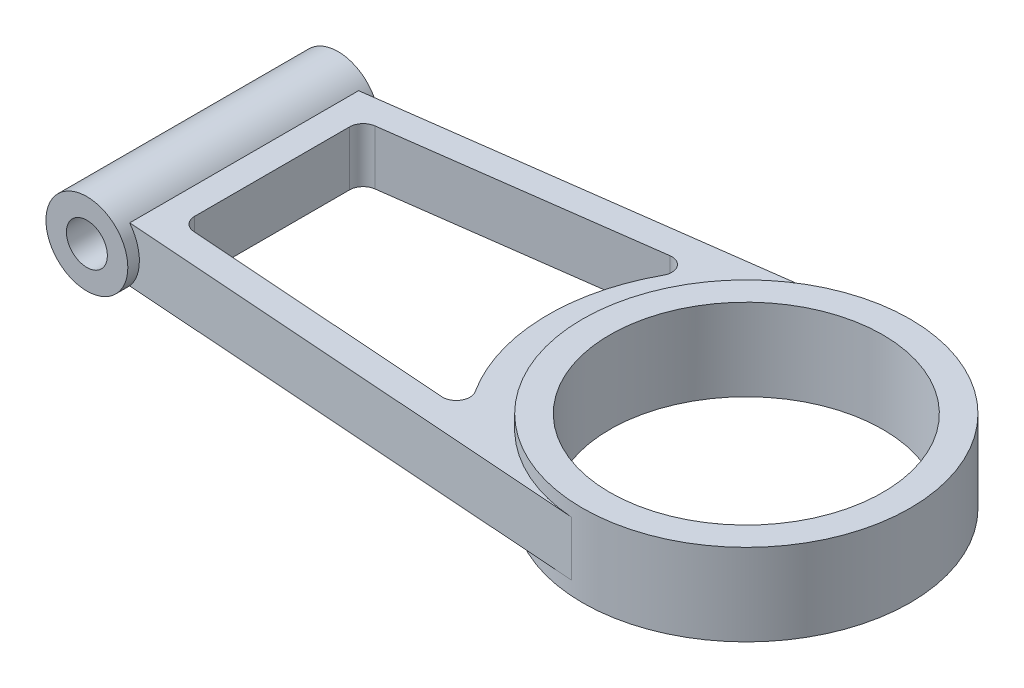
ISO-10303-21;
HEADER;
FILE_DESCRIPTION(('STEP AP214'),'2;1');
FILE_NAME('part.step','',(''),(''),'','','');
FILE_SCHEMA(('AUTOMOTIVE_DESIGN { 1 0 10303 214 1 1 1 1 }'));
ENDSEC;
DATA;
#1=APPLICATION_CONTEXT('core data for automotive mechanical design processes');
#2=APPLICATION_PROTOCOL_DEFINITION('international standard','automotive_design',2000,#1);
#3=PRODUCT_CONTEXT('',#1,'mechanical');
#4=PRODUCT('Part','Part','',(#3));
#5=PRODUCT_RELATED_PRODUCT_CATEGORY('part','',(#4));
#6=PRODUCT_DEFINITION_FORMATION('','',#4);
#7=PRODUCT_DEFINITION_CONTEXT('part definition',#1,'design');
#8=PRODUCT_DEFINITION('design','',#6,#7);
#9=PRODUCT_DEFINITION_SHAPE('','',#8);
#10=(LENGTH_UNIT() NAMED_UNIT(*) SI_UNIT(.MILLI.,.METRE.));
#11=(NAMED_UNIT(*) PLANE_ANGLE_UNIT() SI_UNIT($,.RADIAN.));
#12=(NAMED_UNIT(*) SI_UNIT($,.STERADIAN.) SOLID_ANGLE_UNIT());
#13=UNCERTAINTY_MEASURE_WITH_UNIT(LENGTH_MEASURE(1.E-05),#10,'distance_accuracy_value','');
#14=(GEOMETRIC_REPRESENTATION_CONTEXT(3) GLOBAL_UNCERTAINTY_ASSIGNED_CONTEXT((#13)) GLOBAL_UNIT_ASSIGNED_CONTEXT((#10,
#11,#12)) REPRESENTATION_CONTEXT('',''));
#15=CARTESIAN_POINT('',(0.,0.,0.));
#16=DIRECTION('',(0.,0.,1.));
#17=DIRECTION('',(1.,0.,0.));
#18=AXIS2_PLACEMENT_3D('',#15,#16,#17);
#19=CARTESIAN_POINT('',(0.,-10.,0.));
#20=DIRECTION('',(0.,1.,0.));
#21=DIRECTION('',(0.,0.,1.));
#22=AXIS2_PLACEMENT_3D('',#19,#20,#21);
#23=PLANE('',#22);
#24=CARTESIAN_POINT('',(-45.9529611182613,-10.,-23.2085762529355));
#25=DIRECTION('',(0.,1.,0.));
#26=DIRECTION('',(0.,0.,1.));
#27=AXIS2_PLACEMENT_3D('',#24,#25,#26);
#28=CIRCLE('',#27,5.);
#29=CARTESIAN_POINT('',(-46.6225823905644,-10.,-28.163534108627));
#30=VERTEX_POINT('',#29);
#31=CARTESIAN_POINT('',(-50.9529611182613,-10.,-23.2085762529355));
#32=VERTEX_POINT('',#31);
#33=EDGE_CURVE('E164',#30,#32,#28,.T.);
#34=ORIENTED_EDGE('',*,*,#33,.T.);
#35=DIRECTION('',(0.,0.,1.));
#36=VECTOR('',#35,1.);
#37=CARTESIAN_POINT('',(-50.9529611182613,-10.,0.));
#38=LINE('',#37,#36);
#39=CARTESIAN_POINT('',(-50.9529611182613,-10.,33.5249609813028));
#40=VERTEX_POINT('',#39);
#41=EDGE_CURVE('E188',#32,#40,#38,.T.);
#42=ORIENTED_EDGE('',*,*,#41,.T.);
#43=CARTESIAN_POINT('',(-45.9529611182613,-10.,33.5249609813028));
#44=DIRECTION('',(0.,1.,0.));
#45=DIRECTION('',(0.,0.,1.));
#46=AXIS2_PLACEMENT_3D('',#43,#44,#45);
#47=CIRCLE('',#46,5.);
#48=CARTESIAN_POINT('',(-46.308923364552,-10.,38.5122739732069));
#49=VERTEX_POINT('',#48);
#50=EDGE_CURVE('E185',#40,#49,#47,.T.);
#51=ORIENTED_EDGE('',*,*,#50,.T.);
#52=DIRECTION('',(0.997462598380824,0.,0.071192449258159));
#53=VECTOR('',#52,1.);
#54=CARTESIAN_POINT('',(-2.96953662430921,-10.,41.6055599734971));
#55=LINE('',#54,#53);
#56=CARTESIAN_POINT('',(51.4925258413172,-10.,45.4927108550167));
#57=VERTEX_POINT('',#56);
#58=EDGE_CURVE('E128',#49,#57,#55,.T.);
#59=ORIENTED_EDGE('',*,*,#58,.T.);
#60=CARTESIAN_POINT('',(51.848488087608,-10.,40.5053978631126));
#61=DIRECTION('',(0.,1.,0.));
#62=DIRECTION('',(0.,0.,1.));
#63=AXIS2_PLACEMENT_3D('',#60,#61,#62);
#64=CIRCLE('',#63,5.);
#65=CARTESIAN_POINT('',(56.0565822690377,-10.,37.8050380055717));
#66=VERTEX_POINT('',#65);
#67=EDGE_CURVE('E179',#66,#57,#64,.F.);
#68=ORIENTED_EDGE('',*,*,#67,.F.);
#69=CARTESIAN_POINT('',(114.969900809053,-10.,0.));
#70=DIRECTION('',(0.,1.,0.));
#71=DIRECTION('',(0.,0.,1.));
#72=AXIS2_PLACEMENT_3D('',#69,#70,#71);
#73=CIRCLE('',#72,70.);
#74=CARTESIAN_POINT('',(53.5966107082823,-10.,-33.6648074731859));
#75=VERTEX_POINT('',#74);
#76=EDGE_CURVE('E175',#75,#66,#73,.T.);
#77=ORIENTED_EDGE('',*,*,#76,.F.);
#78=CARTESIAN_POINT('',(49.2128042725129,-10.,-36.0694365784134));
#79=DIRECTION('',(0.,1.,0.));
#80=DIRECTION('',(0.,0.,1.));
#81=AXIS2_PLACEMENT_3D('',#78,#79,#80);
#82=CIRCLE('',#81,5.00000000000001);
#83=CARTESIAN_POINT('',(48.5431830002097,-10.,-41.0243944341049));
#84=VERTEX_POINT('',#83);
#85=EDGE_CURVE('E171',#84,#75,#82,.F.);
#86=ORIENTED_EDGE('',*,*,#85,.F.);
#87=DIRECTION('',(-0.990991571138303,0.,0.13392425446064));
#88=VECTOR('',#87,1.);
#89=CARTESIAN_POINT('',(-4.57401142147053,-10.,-33.8460481502982));
#90=LINE('',#89,#88);
#91=EDGE_CURVE('E167',#84,#30,#90,.T.);
#92=ORIENTED_EDGE('',*,*,#91,.T.);
#93=EDGE_LOOP('',(#34,#42,#51,#59,#68,#77,#86,#92));
#94=FACE_BOUND('',#93,.T.);
#95=DIRECTION('',(0.997462598380824,0.,0.0711924492581591));
#96=VECTOR('',#95,1.);
#97=CARTESIAN_POINT('',(-3.68146111689081,-10.,51.5801859573054));
#98=LINE('',#97,#96);
#99=CARTESIAN_POINT('',(-60.7726212307623,-10.,47.5053870364295));
#100=VERTEX_POINT('',#99);
#101=CARTESIAN_POINT('',(113.395395748354,-10.,59.9363771620822));
#102=VERTEX_POINT('',#101);
#103=EDGE_CURVE('E155',#100,#102,#98,.T.);
#104=ORIENTED_EDGE('',*,*,#103,.F.);
#105=DIRECTION('',(0.,0.,-1.));
#106=VECTOR('',#105,1.);
#107=CARTESIAN_POINT('',(-60.7726212307623,-10.,40.));
#108=LINE('',#107,#106);
#109=CARTESIAN_POINT('',(-60.7726212307623,-10.,-36.3421774329367));
#110=VERTEX_POINT('',#109);
#111=EDGE_CURVE('E238',#110,#100,#108,.F.);
#112=ORIENTED_EDGE('',*,*,#111,.F.);
#113=DIRECTION('',(-0.990991571138303,0.,0.13392425446064));
#114=VECTOR('',#113,1.);
#115=CARTESIAN_POINT('',(-5.91325396607694,-10.,-43.7559638616813));
#116=LINE('',#115,#114);
#117=CARTESIAN_POINT('',(109.631487436205,-10.,-59.3708730090654));
#118=VERTEX_POINT('',#117);
#119=EDGE_CURVE('E159',#118,#110,#116,.T.);
#120=ORIENTED_EDGE('',*,*,#119,.F.);
#121=CARTESIAN_POINT('',(117.666942703843,-10.,0.0886212592327695));
#122=DIRECTION('',(0.,-1.,0.));
#123=DIRECTION('',(0.,0.,-1.));
#124=AXIS2_PLACEMENT_3D('',#121,#122,#123);
#125=CIRCLE('',#124,60.);
#126=EDGE_CURVE('E223',#102,#118,#125,.T.);
#127=ORIENTED_EDGE('',*,*,#126,.F.);
#128=EDGE_LOOP('',(#104,#112,#120,#127));
#129=FACE_BOUND('',#128,.T.);
#130=ADVANCED_FACE('F41',(#94,#129),#23,.F.);
#131=CARTESIAN_POINT('',(0.,10.,0.));
#132=DIRECTION('',(0.,1.,0.));
#133=DIRECTION('',(0.,0.,1.));
#134=AXIS2_PLACEMENT_3D('',#131,#132,#133);
#135=PLANE('',#134);
#136=CARTESIAN_POINT('',(-45.9529611182613,10.,-23.2085762529355));
#137=DIRECTION('',(0.,1.,0.));
#138=DIRECTION('',(0.,0.,1.));
#139=AXIS2_PLACEMENT_3D('',#136,#137,#138);
#140=CIRCLE('',#139,5.);
#141=CARTESIAN_POINT('',(-46.6225823905644,10.,-28.163534108627));
#142=VERTEX_POINT('',#141);
#143=CARTESIAN_POINT('',(-50.9529611182613,10.,-23.2085762529355));
#144=VERTEX_POINT('',#143);
#145=EDGE_CURVE('E265',#142,#144,#140,.T.);
#146=ORIENTED_EDGE('',*,*,#145,.F.);
#147=DIRECTION('',(-0.990991571138303,0.,0.13392425446064));
#148=VECTOR('',#147,1.);
#149=CARTESIAN_POINT('',(-4.57401142147053,10.,-33.8460481502982));
#150=LINE('',#149,#148);
#151=CARTESIAN_POINT('',(48.5431830002097,10.,-41.0243944341049));
#152=VERTEX_POINT('',#151);
#153=EDGE_CURVE('E268',#152,#142,#150,.T.);
#154=ORIENTED_EDGE('',*,*,#153,.F.);
#155=CARTESIAN_POINT('',(49.2128042725129,10.,-36.0694365784134));
#156=DIRECTION('',(0.,1.,0.));
#157=DIRECTION('',(0.,0.,1.));
#158=AXIS2_PLACEMENT_3D('',#155,#156,#157);
#159=CIRCLE('',#158,5.00000000000001);
#160=CARTESIAN_POINT('',(53.5966107082823,10.,-33.6648074731859));
#161=VERTEX_POINT('',#160);
#162=EDGE_CURVE('E272',#152,#161,#159,.F.);
#163=ORIENTED_EDGE('',*,*,#162,.T.);
#164=CARTESIAN_POINT('',(114.969900809053,10.,0.));
#165=DIRECTION('',(0.,1.,0.));
#166=DIRECTION('',(0.,0.,1.));
#167=AXIS2_PLACEMENT_3D('',#164,#165,#166);
#168=CIRCLE('',#167,70.);
#169=CARTESIAN_POINT('',(56.0565822690377,10.,37.8050380055717));
#170=VERTEX_POINT('',#169);
#171=EDGE_CURVE('E276',#161,#170,#168,.T.);
#172=ORIENTED_EDGE('',*,*,#171,.T.);
#173=CARTESIAN_POINT('',(51.848488087608,10.,40.5053978631126));
#174=DIRECTION('',(0.,1.,0.));
#175=DIRECTION('',(0.,0.,1.));
#176=AXIS2_PLACEMENT_3D('',#173,#174,#175);
#177=CIRCLE('',#176,5.);
#178=CARTESIAN_POINT('',(51.4925258413172,10.,45.4927108550167));
#179=VERTEX_POINT('',#178);
#180=EDGE_CURVE('E142',#170,#179,#177,.F.);
#181=ORIENTED_EDGE('',*,*,#180,.T.);
#182=DIRECTION('',(0.997462598380824,0.,0.071192449258159));
#183=VECTOR('',#182,1.);
#184=CARTESIAN_POINT('',(-2.96953662430921,10.,41.6055599734971));
#185=LINE('',#184,#183);
#186=CARTESIAN_POINT('',(-46.308923364552,10.,38.5122739732069));
#187=VERTEX_POINT('',#186);
#188=EDGE_CURVE('E126',#187,#179,#185,.T.);
#189=ORIENTED_EDGE('',*,*,#188,.F.);
#190=CARTESIAN_POINT('',(-45.9529611182613,10.,33.5249609813028));
#191=DIRECTION('',(0.,1.,0.));
#192=DIRECTION('',(0.,0.,1.));
#193=AXIS2_PLACEMENT_3D('',#190,#191,#192);
#194=CIRCLE('',#193,5.);
#195=CARTESIAN_POINT('',(-50.9529611182613,10.,33.5249609813028));
#196=VERTEX_POINT('',#195);
#197=EDGE_CURVE('E140',#196,#187,#194,.T.);
#198=ORIENTED_EDGE('',*,*,#197,.F.);
#199=DIRECTION('',(0.,0.,1.));
#200=VECTOR('',#199,1.);
#201=CARTESIAN_POINT('',(-50.9529611182613,10.,0.));
#202=LINE('',#201,#200);
#203=EDGE_CURVE('E148',#144,#196,#202,.T.);
#204=ORIENTED_EDGE('',*,*,#203,.F.);
#205=EDGE_LOOP('',(#146,#154,#163,#172,#181,#189,#198,#204));
#206=FACE_BOUND('',#205,.T.);
#207=DIRECTION('',(0.,0.,-1.));
#208=VECTOR('',#207,1.);
#209=CARTESIAN_POINT('',(-60.7726212307623,10.,40.));
#210=LINE('',#209,#208);
#211=CARTESIAN_POINT('',(-60.7726212307623,10.,-36.3421774329367));
#212=VERTEX_POINT('',#211);
#213=CARTESIAN_POINT('',(-60.7726212307623,10.,47.5053870364295));
#214=VERTEX_POINT('',#213);
#215=EDGE_CURVE('E11',#212,#214,#210,.F.);
#216=ORIENTED_EDGE('',*,*,#215,.T.);
#217=DIRECTION('',(0.997462598380824,0.,0.0711924492581591));
#218=VECTOR('',#217,1.);
#219=CARTESIAN_POINT('',(-3.68146111689081,10.,51.5801859573054));
#220=LINE('',#219,#218);
#221=CARTESIAN_POINT('',(113.395395748354,10.,59.9363771620822));
#222=VERTEX_POINT('',#221);
#223=EDGE_CURVE('E101',#214,#222,#220,.T.);
#224=ORIENTED_EDGE('',*,*,#223,.T.);
#225=CARTESIAN_POINT('',(117.666942703843,10.,0.0886212592327695));
#226=DIRECTION('',(0.,1.,0.));
#227=DIRECTION('',(0.,0.,1.));
#228=AXIS2_PLACEMENT_3D('',#225,#226,#227);
#229=CIRCLE('',#228,60.);
#230=CARTESIAN_POINT('',(109.631487436205,10.,-59.3708730090654));
#231=VERTEX_POINT('',#230);
#232=EDGE_CURVE('E224',#231,#222,#229,.T.);
#233=ORIENTED_EDGE('',*,*,#232,.F.);
#234=DIRECTION('',(-0.990991571138303,0.,0.13392425446064));
#235=VECTOR('',#234,1.);
#236=CARTESIAN_POINT('',(-5.91325396607694,10.,-43.7559638616813));
#237=LINE('',#236,#235);
#238=EDGE_CURVE('E261',#231,#212,#237,.T.);
#239=ORIENTED_EDGE('',*,*,#238,.T.);
#240=EDGE_LOOP('',(#216,#224,#233,#239));
#241=FACE_BOUND('',#240,.T.);
#242=ADVANCED_FACE('F138',(#206,#241),#135,.T.);
#243=CARTESIAN_POINT('',(-45.9529611182613,10.,-23.2085762529355));
#244=DIRECTION('',(0.,-1.,0.));
#245=DIRECTION('',(0.,0.,-1.));
#246=AXIS2_PLACEMENT_3D('',#243,#244,#245);
#247=CYLINDRICAL_SURFACE('',#246,5.);
#248=ORIENTED_EDGE('',*,*,#33,.F.);
#249=DIRECTION('',(0.,-1.,0.));
#250=VECTOR('',#249,1.);
#251=CARTESIAN_POINT('',(-46.6225823905644,10.,-28.163534108627));
#252=LINE('',#251,#250);
#253=EDGE_CURVE('E51',#142,#30,#252,.T.);
#254=ORIENTED_EDGE('',*,*,#253,.F.);
#255=ORIENTED_EDGE('',*,*,#145,.T.);
#256=DIRECTION('',(0.,-1.,0.));
#257=VECTOR('',#256,1.);
#258=CARTESIAN_POINT('',(-50.9529611182613,10.,-23.2085762529355));
#259=LINE('',#258,#257);
#260=EDGE_CURVE('E59',#144,#32,#259,.T.);
#261=ORIENTED_EDGE('',*,*,#260,.T.);
#262=EDGE_LOOP('',(#248,#254,#255,#261));
#263=FACE_BOUND('',#262,.T.);
#264=ADVANCED_FACE('F300',(#263),#247,.F.);
#265=CARTESIAN_POINT('',(-4.57401142147053,10.,-33.8460481502982));
#266=DIRECTION('',(0.13392425446064,0.,0.990991571138303));
#267=DIRECTION('',(0.990991571138303,0.,-0.13392425446064));
#268=AXIS2_PLACEMENT_3D('',#265,#266,#267);
#269=PLANE('',#268);
#270=ORIENTED_EDGE('',*,*,#91,.F.);
#271=DIRECTION('',(0.,-1.,0.));
#272=VECTOR('',#271,1.);
#273=CARTESIAN_POINT('',(48.5431830002097,10.,-41.0243944341049));
#274=LINE('',#273,#272);
#275=EDGE_CURVE('E207',#152,#84,#274,.T.);
#276=ORIENTED_EDGE('',*,*,#275,.F.);
#277=ORIENTED_EDGE('',*,*,#153,.T.);
#278=ORIENTED_EDGE('',*,*,#253,.T.);
#279=EDGE_LOOP('',(#270,#276,#277,#278));
#280=FACE_BOUND('',#279,.T.);
#281=ADVANCED_FACE('F326',(#280),#269,.T.);
#282=CARTESIAN_POINT('',(49.2128042725129,10.,-36.0694365784134));
#283=DIRECTION('',(0.,-1.,0.));
#284=DIRECTION('',(0.,0.,-1.));
#285=AXIS2_PLACEMENT_3D('',#282,#283,#284);
#286=CYLINDRICAL_SURFACE('',#285,5.00000000000001);
#287=ORIENTED_EDGE('',*,*,#85,.T.);
#288=DIRECTION('',(0.,-1.,0.));
#289=VECTOR('',#288,1.);
#290=CARTESIAN_POINT('',(53.5966107082823,10.,-33.6648074731859));
#291=LINE('',#290,#289);
#292=EDGE_CURVE('E203',#161,#75,#291,.T.);
#293=ORIENTED_EDGE('',*,*,#292,.F.);
#294=ORIENTED_EDGE('',*,*,#162,.F.);
#295=ORIENTED_EDGE('',*,*,#275,.T.);
#296=EDGE_LOOP('',(#287,#293,#294,#295));
#297=FACE_BOUND('',#296,.T.);
#298=ADVANCED_FACE('F322',(#297),#286,.F.);
#299=CARTESIAN_POINT('',(114.969900809053,10.,0.));
#300=DIRECTION('',(0.,-1.,0.));
#301=DIRECTION('',(0.,0.,-1.));
#302=AXIS2_PLACEMENT_3D('',#299,#300,#301);
#303=CYLINDRICAL_SURFACE('',#302,70.);
#304=ORIENTED_EDGE('',*,*,#76,.T.);
#305=DIRECTION('',(0.,-1.,0.));
#306=VECTOR('',#305,1.);
#307=CARTESIAN_POINT('',(56.0565822690377,10.,37.8050380055717));
#308=LINE('',#307,#306);
#309=EDGE_CURVE('E199',#170,#66,#308,.T.);
#310=ORIENTED_EDGE('',*,*,#309,.F.);
#311=ORIENTED_EDGE('',*,*,#171,.F.);
#312=ORIENTED_EDGE('',*,*,#292,.T.);
#313=EDGE_LOOP('',(#304,#310,#311,#312));
#314=FACE_BOUND('',#313,.T.);
#315=ADVANCED_FACE('F318',(#314),#303,.T.);
#316=CARTESIAN_POINT('',(51.848488087608,10.,40.5053978631126));
#317=DIRECTION('',(0.,-1.,0.));
#318=DIRECTION('',(0.,0.,-1.));
#319=AXIS2_PLACEMENT_3D('',#316,#317,#318);
#320=CYLINDRICAL_SURFACE('',#319,5.);
#321=ORIENTED_EDGE('',*,*,#67,.T.);
#322=DIRECTION('',(0.,-1.,0.));
#323=VECTOR('',#322,1.);
#324=CARTESIAN_POINT('',(51.4925258413172,10.,45.4927108550167));
#325=LINE('',#324,#323);
#326=EDGE_CURVE('E133',#179,#57,#325,.T.);
#327=ORIENTED_EDGE('',*,*,#326,.F.);
#328=ORIENTED_EDGE('',*,*,#180,.F.);
#329=ORIENTED_EDGE('',*,*,#309,.T.);
#330=EDGE_LOOP('',(#321,#327,#328,#329));
#331=FACE_BOUND('',#330,.T.);
#332=ADVANCED_FACE('F315',(#331),#320,.F.);
#333=CARTESIAN_POINT('',(-2.96953662430921,10.,41.6055599734971));
#334=DIRECTION('',(0.071192449258159,0.,-0.997462598380824));
#335=DIRECTION('',(-0.997462598380824,0.,-0.071192449258159));
#336=AXIS2_PLACEMENT_3D('',#333,#334,#335);
#337=PLANE('',#336);
#338=ORIENTED_EDGE('',*,*,#58,.F.);
#339=DIRECTION('',(0.,-1.,0.));
#340=VECTOR('',#339,1.);
#341=CARTESIAN_POINT('',(-46.308923364552,10.,38.5122739732069));
#342=LINE('',#341,#340);
#343=EDGE_CURVE('E123',#187,#49,#342,.T.);
#344=ORIENTED_EDGE('',*,*,#343,.F.);
#345=ORIENTED_EDGE('',*,*,#188,.T.);
#346=ORIENTED_EDGE('',*,*,#326,.T.);
#347=EDGE_LOOP('',(#338,#344,#345,#346));
#348=FACE_BOUND('',#347,.T.);
#349=ADVANCED_FACE('F125',(#348),#337,.T.);
#350=CARTESIAN_POINT('',(-45.9529611182613,10.,33.5249609813028));
#351=DIRECTION('',(0.,-1.,0.));
#352=DIRECTION('',(0.,0.,-1.));
#353=AXIS2_PLACEMENT_3D('',#350,#351,#352);
#354=CYLINDRICAL_SURFACE('',#353,5.);
#355=ORIENTED_EDGE('',*,*,#50,.F.);
#356=DIRECTION('',(0.,-1.,0.));
#357=VECTOR('',#356,1.);
#358=CARTESIAN_POINT('',(-50.9529611182613,10.,33.5249609813028));
#359=LINE('',#358,#357);
#360=EDGE_CURVE('E89',#196,#40,#359,.T.);
#361=ORIENTED_EDGE('',*,*,#360,.F.);
#362=ORIENTED_EDGE('',*,*,#197,.T.);
#363=ORIENTED_EDGE('',*,*,#343,.T.);
#364=EDGE_LOOP('',(#355,#361,#362,#363));
#365=FACE_BOUND('',#364,.T.);
#366=ADVANCED_FACE('F146',(#365),#354,.F.);
#367=CARTESIAN_POINT('',(-3.68146111689081,10.,51.5801859573054));
#368=DIRECTION('',(0.0711924492581591,0.,-0.997462598380824));
#369=DIRECTION('',(-0.997462598380824,0.,-0.0711924492581591));
#370=AXIS2_PLACEMENT_3D('',#367,#368,#369);
#371=PLANE('',#370);
#372=CARTESIAN_POINT('',(-71.9529611182613,0.,46.7074064590907));
#373=DIRECTION('',(0.0711924492581591,0.,-0.997462598380824));
#374=DIRECTION('',(-0.997462598380824,0.,-0.0711924492581591));
#375=AXIS2_PLACEMENT_3D('',#372,#373,#374);
#376=ELLIPSE('',#375,15.038157846068,15.);
#377=EDGE_CURVE('E232',#100,#214,#376,.F.);
#378=ORIENTED_EDGE('',*,*,#377,.F.);
#379=ORIENTED_EDGE('',*,*,#103,.T.);
#380=DIRECTION('',(0.,-1.,0.));
#381=VECTOR('',#380,1.);
#382=CARTESIAN_POINT('',(113.395395748354,10.,59.9363771620822));
#383=LINE('',#382,#381);
#384=EDGE_CURVE('E194',#222,#102,#383,.T.);
#385=ORIENTED_EDGE('',*,*,#384,.F.);
#386=ORIENTED_EDGE('',*,*,#223,.F.);
#387=EDGE_LOOP('',(#378,#379,#385,#386));
#388=FACE_BOUND('',#387,.T.);
#389=ADVANCED_FACE('F43',(#388),#371,.F.);
#390=CARTESIAN_POINT('',(117.666942703843,10.,0.0886212592327695));
#391=DIRECTION('',(0.,-1.,0.));
#392=DIRECTION('',(0.,0.,-1.));
#393=AXIS2_PLACEMENT_3D('',#390,#391,#392);
#394=CYLINDRICAL_SURFACE('',#393,60.);
#395=ORIENTED_EDGE('',*,*,#384,.T.);
#396=ORIENTED_EDGE('',*,*,#126,.T.);
#397=DIRECTION('',(0.,-1.,0.));
#398=VECTOR('',#397,1.);
#399=CARTESIAN_POINT('',(109.631487436205,10.,-59.3708730090654));
#400=LINE('',#399,#398);
#401=EDGE_CURVE('E151',#231,#118,#400,.T.);
#402=ORIENTED_EDGE('',*,*,#401,.F.);
#403=ORIENTED_EDGE('',*,*,#232,.T.);
#404=EDGE_LOOP('',(#395,#396,#402,#403));
#405=FACE_BOUND('',#404,.T.);
#406=CARTESIAN_POINT('',(117.666942703843,15.,0.0886212592327695));
#407=DIRECTION('',(0.,1.,0.));
#408=DIRECTION('',(0.,0.,1.));
#409=AXIS2_PLACEMENT_3D('',#406,#407,#408);
#410=CIRCLE('',#409,60.);
#411=CARTESIAN_POINT('',(117.666942703843,15.,60.0886212592328));
#412=VERTEX_POINT('',#411);
#413=EDGE_CURVE('E160',#412,#412,#410,.T.);
#414=ORIENTED_EDGE('',*,*,#413,.F.);
#415=EDGE_LOOP('',(#414));
#416=FACE_BOUND('',#415,.T.);
#417=CARTESIAN_POINT('',(117.666942703843,-15.,0.0886212592327695));
#418=DIRECTION('',(0.,-1.,0.));
#419=DIRECTION('',(0.,0.,-1.));
#420=AXIS2_PLACEMENT_3D('',#417,#418,#419);
#421=CIRCLE('',#420,60.);
#422=CARTESIAN_POINT('',(117.666942703843,-15.,-59.9113787407672));
#423=VERTEX_POINT('',#422);
#424=EDGE_CURVE('E243',#423,#423,#421,.T.);
#425=ORIENTED_EDGE('',*,*,#424,.F.);
#426=EDGE_LOOP('',(#425));
#427=FACE_BOUND('',#426,.T.);
#428=ADVANCED_FACE('F219',(#405,#416,#427),#394,.T.);
#429=CARTESIAN_POINT('',(-5.91325396607694,10.,-43.7559638616813));
#430=DIRECTION('',(0.13392425446064,0.,0.990991571138303));
#431=DIRECTION('',(0.990991571138303,0.,-0.13392425446064));
#432=AXIS2_PLACEMENT_3D('',#429,#430,#431);
#433=PLANE('',#432);
#434=CARTESIAN_POINT('',(-71.9529611182613,0.,-34.8312476453806));
#435=DIRECTION('',(0.13392425446064,0.,0.990991571138303));
#436=DIRECTION('',(0.990991571138303,0.,-0.13392425446064));
#437=AXIS2_PLACEMENT_3D('',#434,#435,#436);
#438=ELLIPSE('',#437,15.136354775218,15.);
#439=EDGE_CURVE('E246',#212,#110,#438,.F.);
#440=ORIENTED_EDGE('',*,*,#439,.F.);
#441=ORIENTED_EDGE('',*,*,#238,.F.);
#442=ORIENTED_EDGE('',*,*,#401,.T.);
#443=ORIENTED_EDGE('',*,*,#119,.T.);
#444=EDGE_LOOP('',(#440,#441,#442,#443));
#445=FACE_BOUND('',#444,.T.);
#446=ADVANCED_FACE('F286',(#445),#433,.F.);
#447=CARTESIAN_POINT('',(-50.9529611182613,10.,0.));
#448=DIRECTION('',(1.,0.,0.));
#449=DIRECTION('',(0.,0.,-1.));
#450=AXIS2_PLACEMENT_3D('',#447,#448,#449);
#451=PLANE('',#450);
#452=ORIENTED_EDGE('',*,*,#41,.F.);
#453=ORIENTED_EDGE('',*,*,#260,.F.);
#454=ORIENTED_EDGE('',*,*,#203,.T.);
#455=ORIENTED_EDGE('',*,*,#360,.T.);
#456=EDGE_LOOP('',(#452,#453,#454,#455));
#457=FACE_BOUND('',#456,.T.);
#458=ADVANCED_FACE('F291',(#457),#451,.T.);
#459=CARTESIAN_POINT('',(117.666942703843,10.,0.0886212592327695));
#460=DIRECTION('',(0.,-1.,0.));
#461=DIRECTION('',(0.,0.,-1.));
#462=AXIS2_PLACEMENT_3D('',#459,#460,#461);
#463=CYLINDRICAL_SURFACE('',#462,50.);
#464=CARTESIAN_POINT('',(117.666942703843,15.,0.0886212592327695));
#465=DIRECTION('',(0.,1.,0.));
#466=DIRECTION('',(0.,0.,1.));
#467=AXIS2_PLACEMENT_3D('',#464,#465,#466);
#468=CIRCLE('',#467,50.);
#469=CARTESIAN_POINT('',(117.666942703843,15.,50.0886212592328));
#470=VERTEX_POINT('',#469);
#471=EDGE_CURVE('E250',#470,#470,#468,.F.);
#472=ORIENTED_EDGE('',*,*,#471,.F.);
#473=EDGE_LOOP('',(#472));
#474=FACE_BOUND('',#473,.T.);
#475=CARTESIAN_POINT('',(117.666942703843,-15.,0.0886212592327695));
#476=DIRECTION('',(0.,-1.,0.));
#477=DIRECTION('',(0.,0.,-1.));
#478=AXIS2_PLACEMENT_3D('',#475,#476,#477);
#479=CIRCLE('',#478,50.);
#480=CARTESIAN_POINT('',(117.666942703843,-15.,-49.9113787407672));
#481=VERTEX_POINT('',#480);
#482=EDGE_CURVE('E237',#481,#481,#479,.F.);
#483=ORIENTED_EDGE('',*,*,#482,.F.);
#484=EDGE_LOOP('',(#483));
#485=FACE_BOUND('',#484,.T.);
#486=ADVANCED_FACE('F304',(#474,#485),#463,.F.);
#487=CARTESIAN_POINT('',(0.,15.,0.));
#488=DIRECTION('',(0.,1.,0.));
#489=DIRECTION('',(0.,0.,1.));
#490=AXIS2_PLACEMENT_3D('',#487,#488,#489);
#491=PLANE('',#490);
#492=ORIENTED_EDGE('',*,*,#471,.T.);
#493=EDGE_LOOP('',(#492));
#494=FACE_BOUND('',#493,.T.);
#495=ORIENTED_EDGE('',*,*,#413,.T.);
#496=EDGE_LOOP('',(#495));
#497=FACE_BOUND('',#496,.T.);
#498=ADVANCED_FACE('F307',(#494,#497),#491,.T.);
#499=CARTESIAN_POINT('',(0.,-15.,0.));
#500=DIRECTION('',(0.,-1.,0.));
#501=DIRECTION('',(0.,0.,-1.));
#502=AXIS2_PLACEMENT_3D('',#499,#500,#501);
#503=PLANE('',#502);
#504=ORIENTED_EDGE('',*,*,#482,.T.);
#505=EDGE_LOOP('',(#504));
#506=FACE_BOUND('',#505,.T.);
#507=ORIENTED_EDGE('',*,*,#424,.T.);
#508=EDGE_LOOP('',(#507));
#509=FACE_BOUND('',#508,.T.);
#510=ADVANCED_FACE('F283',(#506,#509),#503,.T.);
#511=CARTESIAN_POINT('',(-71.9529611182613,0.,40.));
#512=DIRECTION('',(0.,0.,-1.));
#513=DIRECTION('',(-1.,0.,0.));
#514=AXIS2_PLACEMENT_3D('',#511,#512,#513);
#515=CYLINDRICAL_SURFACE('',#514,15.);
#516=CARTESIAN_POINT('',(-71.9529611182613,0.,-40.));
#517=DIRECTION('',(0.,0.,1.));
#518=DIRECTION('',(1.,0.,0.));
#519=AXIS2_PLACEMENT_3D('',#516,#517,#518);
#520=CIRCLE('',#519,15.);
#521=CARTESIAN_POINT('',(-56.9529611182613,0.,-40.));
#522=VERTEX_POINT('',#521);
#523=EDGE_CURVE('E516',#522,#522,#520,.T.);
#524=ORIENTED_EDGE('',*,*,#523,.T.);
#525=EDGE_LOOP('',(#524));
#526=FACE_BOUND('',#525,.T.);
#527=ORIENTED_EDGE('',*,*,#439,.T.);
#528=ORIENTED_EDGE('',*,*,#111,.T.);
#529=ORIENTED_EDGE('',*,*,#377,.T.);
#530=ORIENTED_EDGE('',*,*,#215,.F.);
#531=EDGE_LOOP('',(#527,#528,#529,#530));
#532=FACE_BOUND('',#531,.T.);
#533=CARTESIAN_POINT('',(-71.9529611182613,0.,52.));
#534=DIRECTION('',(0.,0.,1.));
#535=DIRECTION('',(1.,0.,0.));
#536=AXIS2_PLACEMENT_3D('',#533,#534,#535);
#537=CIRCLE('',#536,15.);
#538=CARTESIAN_POINT('',(-56.9529611182613,0.,52.));
#539=VERTEX_POINT('',#538);
#540=EDGE_CURVE('E525',#539,#539,#537,.T.);
#541=ORIENTED_EDGE('',*,*,#540,.F.);
#542=EDGE_LOOP('',(#541));
#543=FACE_BOUND('',#542,.T.);
#544=ADVANCED_FACE('F379',(#526,#532,#543),#515,.T.);
#545=CARTESIAN_POINT('',(-71.9529611182613,0.,-40.));
#546=DIRECTION('',(0.,0.,1.));
#547=DIRECTION('',(1.,0.,0.));
#548=AXIS2_PLACEMENT_3D('',#545,#546,#547);
#549=PLANE('',#548);
#550=ORIENTED_EDGE('',*,*,#523,.F.);
#551=EDGE_LOOP('',(#550));
#552=FACE_BOUND('',#551,.T.);
#553=CARTESIAN_POINT('',(-71.9529611182613,0.,-40.));
#554=DIRECTION('',(0.,0.,1.));
#555=DIRECTION('',(1.,0.,0.));
#556=AXIS2_PLACEMENT_3D('',#553,#554,#555);
#557=CIRCLE('',#556,7.50000000000001);
#558=CARTESIAN_POINT('',(-64.4529611182613,0.,-40.));
#559=VERTEX_POINT('',#558);
#560=EDGE_CURVE('E519',#559,#559,#557,.T.);
#561=ORIENTED_EDGE('',*,*,#560,.T.);
#562=EDGE_LOOP('',(#561));
#563=FACE_BOUND('',#562,.T.);
#564=ADVANCED_FACE('F384',(#552,#563),#549,.F.);
#565=CARTESIAN_POINT('',(-71.9529611182613,0.,40.));
#566=DIRECTION('',(0.,0.,-1.));
#567=DIRECTION('',(-1.,0.,0.));
#568=AXIS2_PLACEMENT_3D('',#565,#566,#567);
#569=CYLINDRICAL_SURFACE('',#568,7.50000000000001);
#570=ORIENTED_EDGE('',*,*,#560,.F.);
#571=EDGE_LOOP('',(#570));
#572=FACE_BOUND('',#571,.T.);
#573=CARTESIAN_POINT('',(-71.9529611182613,0.,52.));
#574=DIRECTION('',(0.,0.,1.));
#575=DIRECTION('',(1.,0.,0.));
#576=AXIS2_PLACEMENT_3D('',#573,#574,#575);
#577=CIRCLE('',#576,7.50000000000001);
#578=CARTESIAN_POINT('',(-64.4529611182613,0.,52.));
#579=VERTEX_POINT('',#578);
#580=EDGE_CURVE('E543',#579,#579,#577,.T.);
#581=ORIENTED_EDGE('',*,*,#580,.T.);
#582=EDGE_LOOP('',(#581));
#583=FACE_BOUND('',#582,.T.);
#584=ADVANCED_FACE('F394',(#572,#583),#569,.F.);
#585=CARTESIAN_POINT('',(-71.9529611182613,0.,52.));
#586=DIRECTION('',(0.,0.,1.));
#587=DIRECTION('',(1.,0.,0.));
#588=AXIS2_PLACEMENT_3D('',#585,#586,#587);
#589=PLANE('',#588);
#590=ORIENTED_EDGE('',*,*,#540,.T.);
#591=EDGE_LOOP('',(#590));
#592=FACE_BOUND('',#591,.T.);
#593=ORIENTED_EDGE('',*,*,#580,.F.);
#594=EDGE_LOOP('',(#593));
#595=FACE_BOUND('',#594,.T.);
#596=ADVANCED_FACE('F398',(#592,#595),#589,.T.);
#597=CLOSED_SHELL('',(#130,#242,#264,#281,#298,#315,#332,#349,#366,#389,#428,#446,#458,#486,
#498,#510,#544,#564,#584,#596));
#598=MANIFOLD_SOLID_BREP('B2',#597);
#599=ADVANCED_BREP_SHAPE_REPRESENTATION('',(#18,#598),#14);
#600=SHAPE_DEFINITION_REPRESENTATION(#9,#599);
ENDSEC;
END-ISO-10303-21;
